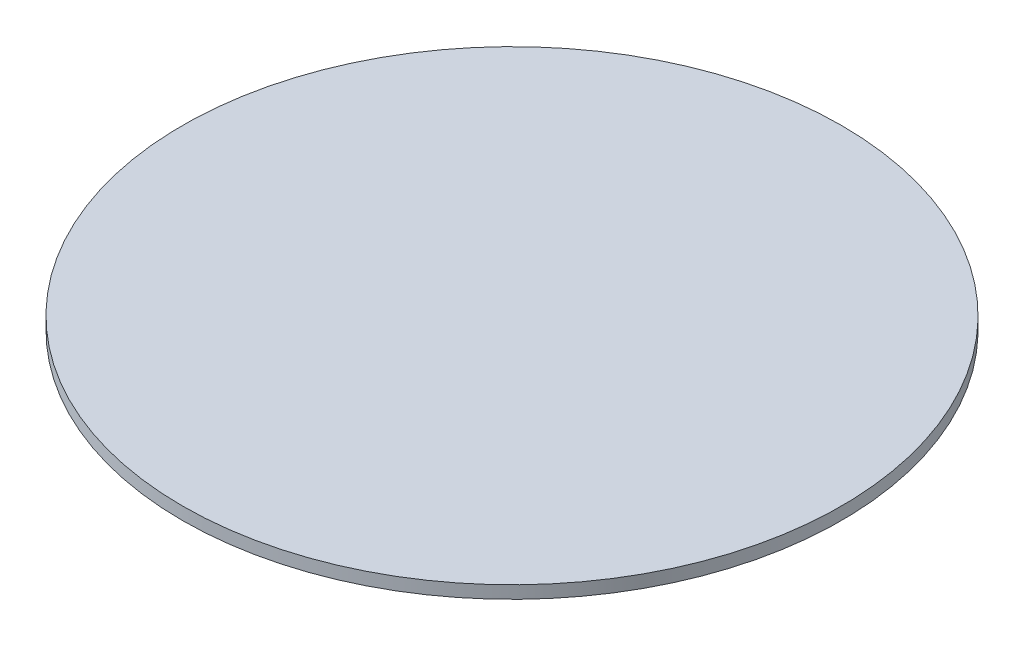
ISO-10303-21;
HEADER;
FILE_DESCRIPTION(('STEP AP214'),'2;1');
FILE_NAME('part.step','',(''),(''),'','','');
FILE_SCHEMA(('AUTOMOTIVE_DESIGN { 1 0 10303 214 1 1 1 1 }'));
ENDSEC;
DATA;
#1=APPLICATION_CONTEXT('core data for automotive mechanical design processes');
#2=APPLICATION_PROTOCOL_DEFINITION('international standard','automotive_design',2000,#1);
#3=PRODUCT_CONTEXT('',#1,'mechanical');
#4=PRODUCT('Part','Part','',(#3));
#5=PRODUCT_RELATED_PRODUCT_CATEGORY('part','',(#4));
#6=PRODUCT_DEFINITION_FORMATION('','',#4);
#7=PRODUCT_DEFINITION_CONTEXT('part definition',#1,'design');
#8=PRODUCT_DEFINITION('design','',#6,#7);
#9=PRODUCT_DEFINITION_SHAPE('','',#8);
#10=(LENGTH_UNIT() NAMED_UNIT(*) SI_UNIT(.MILLI.,.METRE.));
#11=(NAMED_UNIT(*) PLANE_ANGLE_UNIT() SI_UNIT($,.RADIAN.));
#12=(NAMED_UNIT(*) SI_UNIT($,.STERADIAN.) SOLID_ANGLE_UNIT());
#13=UNCERTAINTY_MEASURE_WITH_UNIT(LENGTH_MEASURE(1.E-05),#10,'distance_accuracy_value','');
#14=(GEOMETRIC_REPRESENTATION_CONTEXT(3) GLOBAL_UNCERTAINTY_ASSIGNED_CONTEXT((#13)) GLOBAL_UNIT_ASSIGNED_CONTEXT((#10,
#11,#12)) REPRESENTATION_CONTEXT('',''));
#15=CARTESIAN_POINT('',(0.,0.,0.));
#16=DIRECTION('',(0.,0.,1.));
#17=DIRECTION('',(1.,0.,0.));
#18=AXIS2_PLACEMENT_3D('',#15,#16,#17);
#19=CARTESIAN_POINT('',(0.,3.,0.));
#20=DIRECTION('',(0.,-1.,0.));
#21=DIRECTION('',(0.,0.,-1.));
#22=AXIS2_PLACEMENT_3D('',#19,#20,#21);
#23=CYLINDRICAL_SURFACE('',#22,78.35);
#24=CARTESIAN_POINT('',(0.,3.,0.));
#25=DIRECTION('',(0.,1.,0.));
#26=DIRECTION('',(0.,0.,1.));
#27=AXIS2_PLACEMENT_3D('',#24,#25,#26);
#28=CIRCLE('',#27,78.35);
#29=CARTESIAN_POINT('',(0.,3.,78.35));
#30=VERTEX_POINT('',#29);
#31=EDGE_CURVE('E10',#30,#30,#28,.T.);
#32=ORIENTED_EDGE('',*,*,#31,.F.);
#33=EDGE_LOOP('',(#32));
#34=FACE_BOUND('',#33,.T.);
#35=CARTESIAN_POINT('',(0.,0.,0.));
#36=DIRECTION('',(0.,1.,0.));
#37=DIRECTION('',(0.,0.,1.));
#38=AXIS2_PLACEMENT_3D('',#35,#36,#37);
#39=CIRCLE('',#38,78.35);
#40=CARTESIAN_POINT('',(0.,0.,78.35));
#41=VERTEX_POINT('',#40);
#42=EDGE_CURVE('E40',#41,#41,#39,.T.);
#43=ORIENTED_EDGE('',*,*,#42,.T.);
#44=EDGE_LOOP('',(#43));
#45=FACE_BOUND('',#44,.T.);
#46=ADVANCED_FACE('F37',(#34,#45),#23,.T.);
#47=CARTESIAN_POINT('',(0.,3.,0.));
#48=DIRECTION('',(0.,1.,0.));
#49=DIRECTION('',(0.,0.,1.));
#50=AXIS2_PLACEMENT_3D('',#47,#48,#49);
#51=PLANE('',#50);
#52=ORIENTED_EDGE('',*,*,#31,.T.);
#53=EDGE_LOOP('',(#52));
#54=FACE_BOUND('',#53,.T.);
#55=ADVANCED_FACE('F54',(#54),#51,.T.);
#56=CARTESIAN_POINT('',(0.,0.,0.));
#57=DIRECTION('',(0.,1.,0.));
#58=DIRECTION('',(0.,0.,1.));
#59=AXIS2_PLACEMENT_3D('',#56,#57,#58);
#60=PLANE('',#59);
#61=ORIENTED_EDGE('',*,*,#42,.F.);
#62=EDGE_LOOP('',(#61));
#63=FACE_BOUND('',#62,.T.);
#64=ADVANCED_FACE('F52',(#63),#60,.F.);
#65=CLOSED_SHELL('',(#46,#55,#64));
#66=MANIFOLD_SOLID_BREP('B2',#65);
#67=ADVANCED_BREP_SHAPE_REPRESENTATION('',(#18,#66),#14);
#68=SHAPE_DEFINITION_REPRESENTATION(#9,#67);
ENDSEC;
END-ISO-10303-21;
